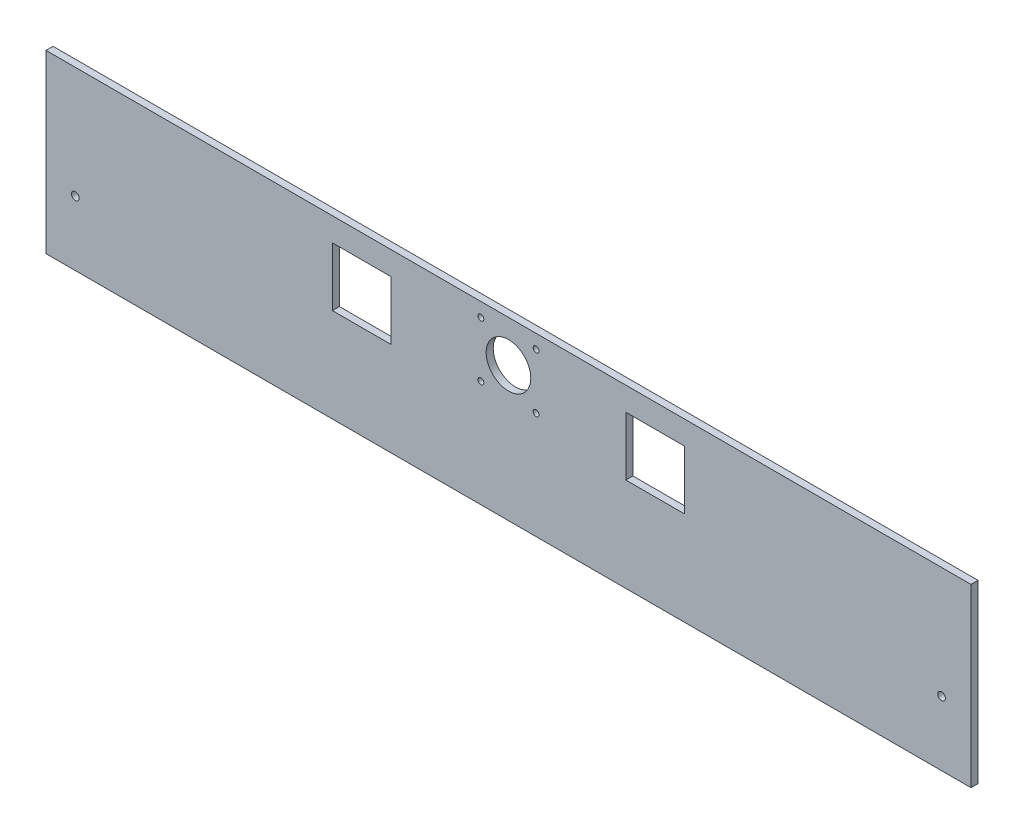
ISO-10303-21;
HEADER;
FILE_DESCRIPTION(('STEP AP214'),'2;1');
FILE_NAME('part.step','',(''),(''),'','','');
FILE_SCHEMA(('AUTOMOTIVE_DESIGN { 1 0 10303 214 1 1 1 1 }'));
ENDSEC;
DATA;
#1=APPLICATION_CONTEXT('core data for automotive mechanical design processes');
#2=APPLICATION_PROTOCOL_DEFINITION('international standard','automotive_design',2000,#1);
#3=PRODUCT_CONTEXT('',#1,'mechanical');
#4=PRODUCT('Part','Part','',(#3));
#5=PRODUCT_RELATED_PRODUCT_CATEGORY('part','',(#4));
#6=PRODUCT_DEFINITION_FORMATION('','',#4);
#7=PRODUCT_DEFINITION_CONTEXT('part definition',#1,'design');
#8=PRODUCT_DEFINITION('design','',#6,#7);
#9=PRODUCT_DEFINITION_SHAPE('','',#8);
#10=(LENGTH_UNIT() NAMED_UNIT(*) SI_UNIT(.MILLI.,.METRE.));
#11=(NAMED_UNIT(*) PLANE_ANGLE_UNIT() SI_UNIT($,.RADIAN.));
#12=(NAMED_UNIT(*) SI_UNIT($,.STERADIAN.) SOLID_ANGLE_UNIT());
#13=UNCERTAINTY_MEASURE_WITH_UNIT(LENGTH_MEASURE(1.E-05),#10,'distance_accuracy_value','');
#14=(GEOMETRIC_REPRESENTATION_CONTEXT(3) GLOBAL_UNCERTAINTY_ASSIGNED_CONTEXT((#13)) GLOBAL_UNIT_ASSIGNED_CONTEXT((#10,
#11,#12)) REPRESENTATION_CONTEXT('',''));
#15=CARTESIAN_POINT('',(0.,0.,0.));
#16=DIRECTION('',(0.,0.,1.));
#17=DIRECTION('',(1.,0.,0.));
#18=AXIS2_PLACEMENT_3D('',#15,#16,#17);
#19=CARTESIAN_POINT('',(394.,-75.,-6.));
#20=DIRECTION('',(1.,0.,0.));
#21=DIRECTION('',(0.,0.,-1.));
#22=AXIS2_PLACEMENT_3D('',#19,#20,#21);
#23=PLANE('',#22);
#24=DIRECTION('',(0.,1.,0.));
#25=VECTOR('',#24,1.);
#26=CARTESIAN_POINT('',(394.,-75.,0.));
#27=LINE('',#26,#25);
#28=CARTESIAN_POINT('',(394.,-75.,0.));
#29=VERTEX_POINT('',#28);
#30=CARTESIAN_POINT('',(394.,75.,0.));
#31=VERTEX_POINT('',#30);
#32=EDGE_CURVE('E166',#29,#31,#27,.T.);
#33=ORIENTED_EDGE('',*,*,#32,.F.);
#34=DIRECTION('',(0.,0.,1.));
#35=VECTOR('',#34,1.);
#36=CARTESIAN_POINT('',(394.,-75.,-6.));
#37=LINE('',#36,#35);
#38=CARTESIAN_POINT('',(394.,-75.,-6.));
#39=VERTEX_POINT('',#38);
#40=EDGE_CURVE('E11',#39,#29,#37,.T.);
#41=ORIENTED_EDGE('',*,*,#40,.F.);
#42=DIRECTION('',(0.,1.,0.));
#43=VECTOR('',#42,1.);
#44=CARTESIAN_POINT('',(394.,-75.,-6.));
#45=LINE('',#44,#43);
#46=CARTESIAN_POINT('',(394.,75.,-6.));
#47=VERTEX_POINT('',#46);
#48=EDGE_CURVE('E199',#39,#47,#45,.T.);
#49=ORIENTED_EDGE('',*,*,#48,.T.);
#50=DIRECTION('',(0.,0.,1.));
#51=VECTOR('',#50,1.);
#52=CARTESIAN_POINT('',(394.,75.,-6.));
#53=LINE('',#52,#51);
#54=EDGE_CURVE('E39',#47,#31,#53,.T.);
#55=ORIENTED_EDGE('',*,*,#54,.T.);
#56=EDGE_LOOP('',(#33,#41,#49,#55));
#57=FACE_BOUND('',#56,.T.);
#58=ADVANCED_FACE('F36',(#57),#23,.T.);
#59=CARTESIAN_POINT('',(-394.,-75.,-6.));
#60=DIRECTION('',(0.,-1.,0.));
#61=DIRECTION('',(0.,0.,-1.));
#62=AXIS2_PLACEMENT_3D('',#59,#60,#61);
#63=PLANE('',#62);
#64=DIRECTION('',(1.,0.,0.));
#65=VECTOR('',#64,1.);
#66=CARTESIAN_POINT('',(-394.,-75.,0.));
#67=LINE('',#66,#65);
#68=CARTESIAN_POINT('',(-394.,-75.,0.));
#69=VERTEX_POINT('',#68);
#70=EDGE_CURVE('E203',#69,#29,#67,.T.);
#71=ORIENTED_EDGE('',*,*,#70,.F.);
#72=DIRECTION('',(0.,0.,1.));
#73=VECTOR('',#72,1.);
#74=CARTESIAN_POINT('',(-394.,-75.,-6.));
#75=LINE('',#74,#73);
#76=CARTESIAN_POINT('',(-394.,-75.,-6.));
#77=VERTEX_POINT('',#76);
#78=EDGE_CURVE('E44',#77,#69,#75,.T.);
#79=ORIENTED_EDGE('',*,*,#78,.F.);
#80=DIRECTION('',(1.,0.,0.));
#81=VECTOR('',#80,1.);
#82=CARTESIAN_POINT('',(-394.,-75.,-6.));
#83=LINE('',#82,#81);
#84=EDGE_CURVE('E209',#77,#39,#83,.T.);
#85=ORIENTED_EDGE('',*,*,#84,.T.);
#86=ORIENTED_EDGE('',*,*,#40,.T.);
#87=EDGE_LOOP('',(#71,#79,#85,#86));
#88=FACE_BOUND('',#87,.T.);
#89=ADVANCED_FACE('F235',(#88),#63,.T.);
#90=CARTESIAN_POINT('',(-394.,-75.,-6.));
#91=DIRECTION('',(-1.,0.,0.));
#92=DIRECTION('',(0.,0.,1.));
#93=AXIS2_PLACEMENT_3D('',#90,#91,#92);
#94=PLANE('',#93);
#95=DIRECTION('',(0.,-1.,0.));
#96=VECTOR('',#95,1.);
#97=CARTESIAN_POINT('',(-394.,-75.,0.));
#98=LINE('',#97,#96);
#99=CARTESIAN_POINT('',(-394.,75.,0.));
#100=VERTEX_POINT('',#99);
#101=EDGE_CURVE('E217',#100,#69,#98,.T.);
#102=ORIENTED_EDGE('',*,*,#101,.F.);
#103=DIRECTION('',(0.,0.,1.));
#104=VECTOR('',#103,1.);
#105=CARTESIAN_POINT('',(-394.,75.,-6.));
#106=LINE('',#105,#104);
#107=CARTESIAN_POINT('',(-394.,75.,-6.));
#108=VERTEX_POINT('',#107);
#109=EDGE_CURVE('E222',#108,#100,#106,.T.);
#110=ORIENTED_EDGE('',*,*,#109,.F.);
#111=DIRECTION('',(0.,-1.,0.));
#112=VECTOR('',#111,1.);
#113=CARTESIAN_POINT('',(-394.,-75.,-6.));
#114=LINE('',#113,#112);
#115=EDGE_CURVE('E206',#108,#77,#114,.T.);
#116=ORIENTED_EDGE('',*,*,#115,.T.);
#117=ORIENTED_EDGE('',*,*,#78,.T.);
#118=EDGE_LOOP('',(#102,#110,#116,#117));
#119=FACE_BOUND('',#118,.T.);
#120=ADVANCED_FACE('F240',(#119),#94,.T.);
#121=CARTESIAN_POINT('',(-394.,75.,-6.));
#122=DIRECTION('',(0.,1.,0.));
#123=DIRECTION('',(0.,0.,1.));
#124=AXIS2_PLACEMENT_3D('',#121,#122,#123);
#125=PLANE('',#124);
#126=DIRECTION('',(-1.,0.,0.));
#127=VECTOR('',#126,1.);
#128=CARTESIAN_POINT('',(-394.,75.,0.));
#129=LINE('',#128,#127);
#130=EDGE_CURVE('E214',#31,#100,#129,.T.);
#131=ORIENTED_EDGE('',*,*,#130,.F.);
#132=ORIENTED_EDGE('',*,*,#54,.F.);
#133=DIRECTION('',(-1.,0.,0.));
#134=VECTOR('',#133,1.);
#135=CARTESIAN_POINT('',(-394.,75.,-6.));
#136=LINE('',#135,#134);
#137=EDGE_CURVE('E202',#47,#108,#136,.T.);
#138=ORIENTED_EDGE('',*,*,#137,.T.);
#139=ORIENTED_EDGE('',*,*,#109,.T.);
#140=EDGE_LOOP('',(#131,#132,#138,#139));
#141=FACE_BOUND('',#140,.T.);
#142=ADVANCED_FACE('F230',(#141),#125,.T.);
#143=CARTESIAN_POINT('',(0.,0.,-6.));
#144=DIRECTION('',(0.,0.,-1.));
#145=DIRECTION('',(-1.,0.,0.));
#146=AXIS2_PLACEMENT_3D('',#143,#144,#145);
#147=PLANE('',#146);
#148=CARTESIAN_POINT('',(369.,-19.9999999999999,-6.));
#149=DIRECTION('',(0.,0.,-1.));
#150=DIRECTION('',(-1.,0.,0.));
#151=AXIS2_PLACEMENT_3D('',#148,#149,#150);
#152=CIRCLE('',#151,3.24999999999995);
#153=CARTESIAN_POINT('',(365.75,-19.9999999999999,-6.));
#154=VERTEX_POINT('',#153);
#155=EDGE_CURVE('E439',#154,#154,#152,.T.);
#156=ORIENTED_EDGE('',*,*,#155,.F.);
#157=EDGE_LOOP('',(#156));
#158=FACE_BOUND('',#157,.T.);
#159=CARTESIAN_POINT('',(-369.,-20.,-6.));
#160=DIRECTION('',(0.,0.,-1.));
#161=DIRECTION('',(-1.,0.,0.));
#162=AXIS2_PLACEMENT_3D('',#159,#160,#161);
#163=CIRCLE('',#162,3.24999999999995);
#164=CARTESIAN_POINT('',(-372.25,-20.,-6.));
#165=VERTEX_POINT('',#164);
#166=EDGE_CURVE('E443',#165,#165,#163,.T.);
#167=ORIENTED_EDGE('',*,*,#166,.F.);
#168=EDGE_LOOP('',(#167));
#169=FACE_BOUND('',#168,.T.);
#170=CARTESIAN_POINT('',(-23.5,63.15,-6.));
#171=DIRECTION('',(0.,0.,-1.));
#172=DIRECTION('',(-1.,0.,0.));
#173=AXIS2_PLACEMENT_3D('',#170,#171,#172);
#174=CIRCLE('',#173,2.5);
#175=CARTESIAN_POINT('',(-26.,63.15,-6.));
#176=VERTEX_POINT('',#175);
#177=EDGE_CURVE('E153',#176,#176,#174,.T.);
#178=ORIENTED_EDGE('',*,*,#177,.F.);
#179=EDGE_LOOP('',(#178));
#180=FACE_BOUND('',#179,.T.);
#181=CARTESIAN_POINT('',(-23.5,16.15,-6.));
#182=DIRECTION('',(0.,0.,-1.));
#183=DIRECTION('',(-1.,0.,0.));
#184=AXIS2_PLACEMENT_3D('',#181,#182,#183);
#185=CIRCLE('',#184,2.5);
#186=CARTESIAN_POINT('',(-26.,16.15,-6.));
#187=VERTEX_POINT('',#186);
#188=EDGE_CURVE('E475',#187,#187,#185,.T.);
#189=ORIENTED_EDGE('',*,*,#188,.F.);
#190=EDGE_LOOP('',(#189));
#191=FACE_BOUND('',#190,.T.);
#192=CARTESIAN_POINT('',(23.5,16.15,-6.));
#193=DIRECTION('',(0.,0.,-1.));
#194=DIRECTION('',(-1.,0.,0.));
#195=AXIS2_PLACEMENT_3D('',#192,#193,#194);
#196=CIRCLE('',#195,2.5);
#197=CARTESIAN_POINT('',(21.,16.15,-6.));
#198=VERTEX_POINT('',#197);
#199=EDGE_CURVE('E473',#198,#198,#196,.T.);
#200=ORIENTED_EDGE('',*,*,#199,.F.);
#201=EDGE_LOOP('',(#200));
#202=FACE_BOUND('',#201,.T.);
#203=CARTESIAN_POINT('',(23.5,63.15,-6.));
#204=DIRECTION('',(0.,0.,-1.));
#205=DIRECTION('',(-1.,0.,0.));
#206=AXIS2_PLACEMENT_3D('',#203,#204,#205);
#207=CIRCLE('',#206,2.5);
#208=CARTESIAN_POINT('',(21.,63.15,-6.));
#209=VERTEX_POINT('',#208);
#210=EDGE_CURVE('E470',#209,#209,#207,.T.);
#211=ORIENTED_EDGE('',*,*,#210,.F.);
#212=EDGE_LOOP('',(#211));
#213=FACE_BOUND('',#212,.T.);
#214=CARTESIAN_POINT('',(0.,39.65,-6.));
#215=DIRECTION('',(0.,0.,-1.));
#216=DIRECTION('',(-1.,0.,0.));
#217=AXIS2_PLACEMENT_3D('',#214,#215,#216);
#218=CIRCLE('',#217,19.);
#219=CARTESIAN_POINT('',(-19.,39.65,-6.));
#220=VERTEX_POINT('',#219);
#221=EDGE_CURVE('E467',#220,#220,#218,.T.);
#222=ORIENTED_EDGE('',*,*,#221,.F.);
#223=EDGE_LOOP('',(#222));
#224=FACE_BOUND('',#223,.T.);
#225=DIRECTION('',(0.,1.,0.));
#226=VECTOR('',#225,1.);
#227=CARTESIAN_POINT('',(-100.,5.,-6.));
#228=LINE('',#227,#226);
#229=CARTESIAN_POINT('',(-100.,5.,-6.));
#230=VERTEX_POINT('',#229);
#231=CARTESIAN_POINT('',(-100.,55.,-6.));
#232=VERTEX_POINT('',#231);
#233=EDGE_CURVE('E129',#230,#232,#228,.T.);
#234=ORIENTED_EDGE('',*,*,#233,.T.);
#235=DIRECTION('',(-1.,0.,0.));
#236=VECTOR('',#235,1.);
#237=CARTESIAN_POINT('',(-150.,55.,-6.));
#238=LINE('',#237,#236);
#239=CARTESIAN_POINT('',(-150.,55.,-6.));
#240=VERTEX_POINT('',#239);
#241=EDGE_CURVE('E140',#232,#240,#238,.T.);
#242=ORIENTED_EDGE('',*,*,#241,.T.);
#243=DIRECTION('',(0.,-1.,0.));
#244=VECTOR('',#243,1.);
#245=CARTESIAN_POINT('',(-150.,5.,-6.));
#246=LINE('',#245,#244);
#247=CARTESIAN_POINT('',(-150.,5.,-6.));
#248=VERTEX_POINT('',#247);
#249=EDGE_CURVE('E52',#240,#248,#246,.T.);
#250=ORIENTED_EDGE('',*,*,#249,.T.);
#251=DIRECTION('',(1.,0.,0.));
#252=VECTOR('',#251,1.);
#253=CARTESIAN_POINT('',(-150.,5.,-6.));
#254=LINE('',#253,#252);
#255=EDGE_CURVE('E137',#248,#230,#254,.T.);
#256=ORIENTED_EDGE('',*,*,#255,.T.);
#257=EDGE_LOOP('',(#234,#242,#250,#256));
#258=FACE_BOUND('',#257,.T.);
#259=DIRECTION('',(0.,1.,0.));
#260=VECTOR('',#259,1.);
#261=CARTESIAN_POINT('',(150.,5.00000000000001,-6.));
#262=LINE('',#261,#260);
#263=CARTESIAN_POINT('',(150.,5.00000000000001,-6.));
#264=VERTEX_POINT('',#263);
#265=CARTESIAN_POINT('',(150.,55.,-6.));
#266=VERTEX_POINT('',#265);
#267=EDGE_CURVE('E170',#264,#266,#262,.T.);
#268=ORIENTED_EDGE('',*,*,#267,.T.);
#269=DIRECTION('',(-1.,0.,0.));
#270=VECTOR('',#269,1.);
#271=CARTESIAN_POINT('',(100.,55.,-6.));
#272=LINE('',#271,#270);
#273=CARTESIAN_POINT('',(100.,55.,-6.));
#274=VERTEX_POINT('',#273);
#275=EDGE_CURVE('E173',#266,#274,#272,.T.);
#276=ORIENTED_EDGE('',*,*,#275,.T.);
#277=DIRECTION('',(0.,-1.,0.));
#278=VECTOR('',#277,1.);
#279=CARTESIAN_POINT('',(100.,5.00000000000001,-6.));
#280=LINE('',#279,#278);
#281=CARTESIAN_POINT('',(100.,5.00000000000001,-6.));
#282=VERTEX_POINT('',#281);
#283=EDGE_CURVE('E60',#274,#282,#280,.T.);
#284=ORIENTED_EDGE('',*,*,#283,.T.);
#285=DIRECTION('',(1.,0.,0.));
#286=VECTOR('',#285,1.);
#287=CARTESIAN_POINT('',(100.,5.00000000000001,-6.));
#288=LINE('',#287,#286);
#289=EDGE_CURVE('E178',#282,#264,#288,.T.);
#290=ORIENTED_EDGE('',*,*,#289,.T.);
#291=EDGE_LOOP('',(#268,#276,#284,#290));
#292=FACE_BOUND('',#291,.T.);
#293=ORIENTED_EDGE('',*,*,#48,.F.);
#294=ORIENTED_EDGE('',*,*,#84,.F.);
#295=ORIENTED_EDGE('',*,*,#115,.F.);
#296=ORIENTED_EDGE('',*,*,#137,.F.);
#297=EDGE_LOOP('',(#293,#294,#295,#296));
#298=FACE_BOUND('',#297,.T.);
#299=ADVANCED_FACE('F144',(#158,#169,#180,#191,#202,#213,#224,#258,#292,#298),#147,.T.);
#300=CARTESIAN_POINT('',(0.,0.,0.));
#301=DIRECTION('',(0.,0.,-1.));
#302=DIRECTION('',(-1.,0.,0.));
#303=AXIS2_PLACEMENT_3D('',#300,#301,#302);
#304=PLANE('',#303);
#305=CARTESIAN_POINT('',(369.,-19.9999999999999,0.));
#306=DIRECTION('',(0.,0.,1.));
#307=DIRECTION('',(1.,0.,0.));
#308=AXIS2_PLACEMENT_3D('',#305,#306,#307);
#309=CIRCLE('',#308,3.24999999999995);
#310=CARTESIAN_POINT('',(372.25,-19.9999999999999,0.));
#311=VERTEX_POINT('',#310);
#312=EDGE_CURVE('E442',#311,#311,#309,.T.);
#313=ORIENTED_EDGE('',*,*,#312,.F.);
#314=EDGE_LOOP('',(#313));
#315=FACE_BOUND('',#314,.T.);
#316=CARTESIAN_POINT('',(-369.,-20.,0.));
#317=DIRECTION('',(0.,0.,1.));
#318=DIRECTION('',(1.,0.,0.));
#319=AXIS2_PLACEMENT_3D('',#316,#317,#318);
#320=CIRCLE('',#319,3.24999999999995);
#321=CARTESIAN_POINT('',(-365.75,-20.,0.));
#322=VERTEX_POINT('',#321);
#323=EDGE_CURVE('E444',#322,#322,#320,.T.);
#324=ORIENTED_EDGE('',*,*,#323,.F.);
#325=EDGE_LOOP('',(#324));
#326=FACE_BOUND('',#325,.T.);
#327=CARTESIAN_POINT('',(-23.5,63.15,0.));
#328=DIRECTION('',(0.,0.,1.));
#329=DIRECTION('',(1.,0.,0.));
#330=AXIS2_PLACEMENT_3D('',#327,#328,#329);
#331=CIRCLE('',#330,2.5);
#332=CARTESIAN_POINT('',(-21.,63.15,0.));
#333=VERTEX_POINT('',#332);
#334=EDGE_CURVE('E452',#333,#333,#331,.T.);
#335=ORIENTED_EDGE('',*,*,#334,.F.);
#336=EDGE_LOOP('',(#335));
#337=FACE_BOUND('',#336,.T.);
#338=CARTESIAN_POINT('',(-23.5,16.15,0.));
#339=DIRECTION('',(0.,0.,1.));
#340=DIRECTION('',(1.,0.,0.));
#341=AXIS2_PLACEMENT_3D('',#338,#339,#340);
#342=CIRCLE('',#341,2.5);
#343=CARTESIAN_POINT('',(-21.,16.15,0.));
#344=VERTEX_POINT('',#343);
#345=EDGE_CURVE('E460',#344,#344,#342,.T.);
#346=ORIENTED_EDGE('',*,*,#345,.F.);
#347=EDGE_LOOP('',(#346));
#348=FACE_BOUND('',#347,.T.);
#349=CARTESIAN_POINT('',(23.5,16.15,0.));
#350=DIRECTION('',(0.,0.,1.));
#351=DIRECTION('',(1.,0.,0.));
#352=AXIS2_PLACEMENT_3D('',#349,#350,#351);
#353=CIRCLE('',#352,2.5);
#354=CARTESIAN_POINT('',(26.,16.15,0.));
#355=VERTEX_POINT('',#354);
#356=EDGE_CURVE('E457',#355,#355,#353,.T.);
#357=ORIENTED_EDGE('',*,*,#356,.F.);
#358=EDGE_LOOP('',(#357));
#359=FACE_BOUND('',#358,.T.);
#360=CARTESIAN_POINT('',(23.5,63.15,0.));
#361=DIRECTION('',(0.,0.,1.));
#362=DIRECTION('',(1.,0.,0.));
#363=AXIS2_PLACEMENT_3D('',#360,#361,#362);
#364=CIRCLE('',#363,2.5);
#365=CARTESIAN_POINT('',(26.,63.15,0.));
#366=VERTEX_POINT('',#365);
#367=EDGE_CURVE('E453',#366,#366,#364,.T.);
#368=ORIENTED_EDGE('',*,*,#367,.F.);
#369=EDGE_LOOP('',(#368));
#370=FACE_BOUND('',#369,.T.);
#371=CARTESIAN_POINT('',(0.,39.65,0.));
#372=DIRECTION('',(0.,0.,1.));
#373=DIRECTION('',(1.,0.,0.));
#374=AXIS2_PLACEMENT_3D('',#371,#372,#373);
#375=CIRCLE('',#374,19.);
#376=CARTESIAN_POINT('',(19.,39.65,0.));
#377=VERTEX_POINT('',#376);
#378=EDGE_CURVE('E456',#377,#377,#375,.T.);
#379=ORIENTED_EDGE('',*,*,#378,.F.);
#380=EDGE_LOOP('',(#379));
#381=FACE_BOUND('',#380,.T.);
#382=DIRECTION('',(-1.,0.,0.));
#383=VECTOR('',#382,1.);
#384=CARTESIAN_POINT('',(-150.,55.,0.));
#385=LINE('',#384,#383);
#386=CARTESIAN_POINT('',(-100.,55.,0.));
#387=VERTEX_POINT('',#386);
#388=CARTESIAN_POINT('',(-150.,55.,0.));
#389=VERTEX_POINT('',#388);
#390=EDGE_CURVE('E159',#387,#389,#385,.T.);
#391=ORIENTED_EDGE('',*,*,#390,.F.);
#392=DIRECTION('',(0.,1.,0.));
#393=VECTOR('',#392,1.);
#394=CARTESIAN_POINT('',(-100.,5.,0.));
#395=LINE('',#394,#393);
#396=CARTESIAN_POINT('',(-100.,5.,0.));
#397=VERTEX_POINT('',#396);
#398=EDGE_CURVE('E132',#397,#387,#395,.T.);
#399=ORIENTED_EDGE('',*,*,#398,.F.);
#400=DIRECTION('',(1.,0.,0.));
#401=VECTOR('',#400,1.);
#402=CARTESIAN_POINT('',(-150.,5.,0.));
#403=LINE('',#402,#401);
#404=CARTESIAN_POINT('',(-150.,5.,0.));
#405=VERTEX_POINT('',#404);
#406=EDGE_CURVE('E147',#405,#397,#403,.T.);
#407=ORIENTED_EDGE('',*,*,#406,.F.);
#408=DIRECTION('',(0.,-1.,0.));
#409=VECTOR('',#408,1.);
#410=CARTESIAN_POINT('',(-150.,5.,0.));
#411=LINE('',#410,#409);
#412=EDGE_CURVE('E150',#389,#405,#411,.T.);
#413=ORIENTED_EDGE('',*,*,#412,.F.);
#414=EDGE_LOOP('',(#391,#399,#407,#413));
#415=FACE_BOUND('',#414,.T.);
#416=DIRECTION('',(-1.,0.,0.));
#417=VECTOR('',#416,1.);
#418=CARTESIAN_POINT('',(100.,55.,0.));
#419=LINE('',#418,#417);
#420=CARTESIAN_POINT('',(150.,55.,0.));
#421=VERTEX_POINT('',#420);
#422=CARTESIAN_POINT('',(100.,55.,0.));
#423=VERTEX_POINT('',#422);
#424=EDGE_CURVE('E184',#421,#423,#419,.T.);
#425=ORIENTED_EDGE('',*,*,#424,.F.);
#426=DIRECTION('',(0.,1.,0.));
#427=VECTOR('',#426,1.);
#428=CARTESIAN_POINT('',(150.,5.00000000000001,0.));
#429=LINE('',#428,#427);
#430=CARTESIAN_POINT('',(150.,5.00000000000001,0.));
#431=VERTEX_POINT('',#430);
#432=EDGE_CURVE('E182',#431,#421,#429,.T.);
#433=ORIENTED_EDGE('',*,*,#432,.F.);
#434=DIRECTION('',(1.,0.,0.));
#435=VECTOR('',#434,1.);
#436=CARTESIAN_POINT('',(100.,5.00000000000001,0.));
#437=LINE('',#436,#435);
#438=CARTESIAN_POINT('',(100.,5.00000000000001,0.));
#439=VERTEX_POINT('',#438);
#440=EDGE_CURVE('E174',#439,#431,#437,.T.);
#441=ORIENTED_EDGE('',*,*,#440,.F.);
#442=DIRECTION('',(0.,-1.,0.));
#443=VECTOR('',#442,1.);
#444=CARTESIAN_POINT('',(100.,5.00000000000001,0.));
#445=LINE('',#444,#443);
#446=EDGE_CURVE('E187',#423,#439,#445,.T.);
#447=ORIENTED_EDGE('',*,*,#446,.F.);
#448=EDGE_LOOP('',(#425,#433,#441,#447));
#449=FACE_BOUND('',#448,.T.);
#450=ORIENTED_EDGE('',*,*,#32,.T.);
#451=ORIENTED_EDGE('',*,*,#130,.T.);
#452=ORIENTED_EDGE('',*,*,#101,.T.);
#453=ORIENTED_EDGE('',*,*,#70,.T.);
#454=EDGE_LOOP('',(#450,#451,#452,#453));
#455=FACE_BOUND('',#454,.T.);
#456=ADVANCED_FACE('F232',(#315,#326,#337,#348,#359,#370,#381,#415,#449,#455),#304,.F.);
#457=CARTESIAN_POINT('',(150.,5.00000000000001,-6.));
#458=DIRECTION('',(1.,0.,0.));
#459=DIRECTION('',(0.,0.,-1.));
#460=AXIS2_PLACEMENT_3D('',#457,#458,#459);
#461=PLANE('',#460);
#462=ORIENTED_EDGE('',*,*,#432,.T.);
#463=DIRECTION('',(0.,0.,1.));
#464=VECTOR('',#463,1.);
#465=CARTESIAN_POINT('',(150.,55.,-6.));
#466=LINE('',#465,#464);
#467=EDGE_CURVE('E181',#266,#421,#466,.T.);
#468=ORIENTED_EDGE('',*,*,#467,.F.);
#469=ORIENTED_EDGE('',*,*,#267,.F.);
#470=DIRECTION('',(0.,0.,1.));
#471=VECTOR('',#470,1.);
#472=CARTESIAN_POINT('',(150.,5.00000000000001,-6.));
#473=LINE('',#472,#471);
#474=EDGE_CURVE('E160',#264,#431,#473,.T.);
#475=ORIENTED_EDGE('',*,*,#474,.T.);
#476=EDGE_LOOP('',(#462,#468,#469,#475));
#477=FACE_BOUND('',#476,.T.);
#478=ADVANCED_FACE('F275',(#477),#461,.F.);
#479=CARTESIAN_POINT('',(100.,5.00000000000001,-6.));
#480=DIRECTION('',(0.,-1.,0.));
#481=DIRECTION('',(0.,0.,-1.));
#482=AXIS2_PLACEMENT_3D('',#479,#480,#481);
#483=PLANE('',#482);
#484=ORIENTED_EDGE('',*,*,#440,.T.);
#485=ORIENTED_EDGE('',*,*,#474,.F.);
#486=ORIENTED_EDGE('',*,*,#289,.F.);
#487=DIRECTION('',(0.,0.,1.));
#488=VECTOR('',#487,1.);
#489=CARTESIAN_POINT('',(100.,5.00000000000001,-6.));
#490=LINE('',#489,#488);
#491=EDGE_CURVE('E193',#282,#439,#490,.T.);
#492=ORIENTED_EDGE('',*,*,#491,.T.);
#493=EDGE_LOOP('',(#484,#485,#486,#492));
#494=FACE_BOUND('',#493,.T.);
#495=ADVANCED_FACE('F280',(#494),#483,.F.);
#496=CARTESIAN_POINT('',(100.,5.00000000000001,-6.));
#497=DIRECTION('',(-1.,0.,0.));
#498=DIRECTION('',(0.,0.,1.));
#499=AXIS2_PLACEMENT_3D('',#496,#497,#498);
#500=PLANE('',#499);
#501=ORIENTED_EDGE('',*,*,#446,.T.);
#502=ORIENTED_EDGE('',*,*,#491,.F.);
#503=ORIENTED_EDGE('',*,*,#283,.F.);
#504=DIRECTION('',(0.,0.,1.));
#505=VECTOR('',#504,1.);
#506=CARTESIAN_POINT('',(100.,55.,-6.));
#507=LINE('',#506,#505);
#508=EDGE_CURVE('E195',#274,#423,#507,.T.);
#509=ORIENTED_EDGE('',*,*,#508,.T.);
#510=EDGE_LOOP('',(#501,#502,#503,#509));
#511=FACE_BOUND('',#510,.T.);
#512=ADVANCED_FACE('F292',(#511),#500,.F.);
#513=CARTESIAN_POINT('',(100.,55.,-6.));
#514=DIRECTION('',(0.,1.,0.));
#515=DIRECTION('',(0.,0.,1.));
#516=AXIS2_PLACEMENT_3D('',#513,#514,#515);
#517=PLANE('',#516);
#518=ORIENTED_EDGE('',*,*,#424,.T.);
#519=ORIENTED_EDGE('',*,*,#508,.F.);
#520=ORIENTED_EDGE('',*,*,#275,.F.);
#521=ORIENTED_EDGE('',*,*,#467,.T.);
#522=EDGE_LOOP('',(#518,#519,#520,#521));
#523=FACE_BOUND('',#522,.T.);
#524=ADVANCED_FACE('F302',(#523),#517,.F.);
#525=CARTESIAN_POINT('',(-100.,5.,-6.));
#526=DIRECTION('',(1.,0.,0.));
#527=DIRECTION('',(0.,0.,-1.));
#528=AXIS2_PLACEMENT_3D('',#525,#526,#527);
#529=PLANE('',#528);
#530=ORIENTED_EDGE('',*,*,#398,.T.);
#531=DIRECTION('',(0.,0.,1.));
#532=VECTOR('',#531,1.);
#533=CARTESIAN_POINT('',(-100.,55.,-6.));
#534=LINE('',#533,#532);
#535=EDGE_CURVE('E125',#232,#387,#534,.T.);
#536=ORIENTED_EDGE('',*,*,#535,.F.);
#537=ORIENTED_EDGE('',*,*,#233,.F.);
#538=DIRECTION('',(0.,0.,1.));
#539=VECTOR('',#538,1.);
#540=CARTESIAN_POINT('',(-100.,5.,-6.));
#541=LINE('',#540,#539);
#542=EDGE_CURVE('E164',#230,#397,#541,.T.);
#543=ORIENTED_EDGE('',*,*,#542,.T.);
#544=EDGE_LOOP('',(#530,#536,#537,#543));
#545=FACE_BOUND('',#544,.T.);
#546=ADVANCED_FACE('F127',(#545),#529,.F.);
#547=CARTESIAN_POINT('',(-150.,5.,-6.));
#548=DIRECTION('',(0.,-1.,0.));
#549=DIRECTION('',(0.,0.,-1.));
#550=AXIS2_PLACEMENT_3D('',#547,#548,#549);
#551=PLANE('',#550);
#552=ORIENTED_EDGE('',*,*,#406,.T.);
#553=ORIENTED_EDGE('',*,*,#542,.F.);
#554=ORIENTED_EDGE('',*,*,#255,.F.);
#555=DIRECTION('',(0.,0.,1.));
#556=VECTOR('',#555,1.);
#557=CARTESIAN_POINT('',(-150.,5.,-6.));
#558=LINE('',#557,#556);
#559=EDGE_CURVE('E167',#248,#405,#558,.T.);
#560=ORIENTED_EDGE('',*,*,#559,.T.);
#561=EDGE_LOOP('',(#552,#553,#554,#560));
#562=FACE_BOUND('',#561,.T.);
#563=ADVANCED_FACE('F320',(#562),#551,.F.);
#564=CARTESIAN_POINT('',(-150.,5.,-6.));
#565=DIRECTION('',(-1.,0.,0.));
#566=DIRECTION('',(0.,0.,1.));
#567=AXIS2_PLACEMENT_3D('',#564,#565,#566);
#568=PLANE('',#567);
#569=ORIENTED_EDGE('',*,*,#412,.T.);
#570=ORIENTED_EDGE('',*,*,#559,.F.);
#571=ORIENTED_EDGE('',*,*,#249,.F.);
#572=DIRECTION('',(0.,0.,1.));
#573=VECTOR('',#572,1.);
#574=CARTESIAN_POINT('',(-150.,55.,-6.));
#575=LINE('',#574,#573);
#576=EDGE_CURVE('E136',#240,#389,#575,.T.);
#577=ORIENTED_EDGE('',*,*,#576,.T.);
#578=EDGE_LOOP('',(#569,#570,#571,#577));
#579=FACE_BOUND('',#578,.T.);
#580=ADVANCED_FACE('F329',(#579),#568,.F.);
#581=CARTESIAN_POINT('',(-150.,55.,-6.));
#582=DIRECTION('',(0.,1.,0.));
#583=DIRECTION('',(0.,0.,1.));
#584=AXIS2_PLACEMENT_3D('',#581,#582,#583);
#585=PLANE('',#584);
#586=ORIENTED_EDGE('',*,*,#390,.T.);
#587=ORIENTED_EDGE('',*,*,#576,.F.);
#588=ORIENTED_EDGE('',*,*,#241,.F.);
#589=ORIENTED_EDGE('',*,*,#535,.T.);
#590=EDGE_LOOP('',(#586,#587,#588,#589));
#591=FACE_BOUND('',#590,.T.);
#592=ADVANCED_FACE('F141',(#591),#585,.F.);
#593=CARTESIAN_POINT('',(0.,39.65,-10.));
#594=DIRECTION('',(0.,0.,1.));
#595=DIRECTION('',(1.,0.,0.));
#596=AXIS2_PLACEMENT_3D('',#593,#594,#595);
#597=CYLINDRICAL_SURFACE('',#596,19.);
#598=ORIENTED_EDGE('',*,*,#221,.T.);
#599=EDGE_LOOP('',(#598));
#600=FACE_BOUND('',#599,.T.);
#601=ORIENTED_EDGE('',*,*,#378,.T.);
#602=EDGE_LOOP('',(#601));
#603=FACE_BOUND('',#602,.T.);
#604=ADVANCED_FACE('F347',(#600,#603),#597,.F.);
#605=CARTESIAN_POINT('',(23.5,63.15,-10.));
#606=DIRECTION('',(0.,0.,1.));
#607=DIRECTION('',(1.,0.,0.));
#608=AXIS2_PLACEMENT_3D('',#605,#606,#607);
#609=CYLINDRICAL_SURFACE('',#608,2.5);
#610=ORIENTED_EDGE('',*,*,#210,.T.);
#611=EDGE_LOOP('',(#610));
#612=FACE_BOUND('',#611,.T.);
#613=ORIENTED_EDGE('',*,*,#367,.T.);
#614=EDGE_LOOP('',(#613));
#615=FACE_BOUND('',#614,.T.);
#616=ADVANCED_FACE('F356',(#612,#615),#609,.F.);
#617=CARTESIAN_POINT('',(23.5,16.15,-10.));
#618=DIRECTION('',(0.,0.,1.));
#619=DIRECTION('',(1.,0.,0.));
#620=AXIS2_PLACEMENT_3D('',#617,#618,#619);
#621=CYLINDRICAL_SURFACE('',#620,2.5);
#622=ORIENTED_EDGE('',*,*,#199,.T.);
#623=EDGE_LOOP('',(#622));
#624=FACE_BOUND('',#623,.T.);
#625=ORIENTED_EDGE('',*,*,#356,.T.);
#626=EDGE_LOOP('',(#625));
#627=FACE_BOUND('',#626,.T.);
#628=ADVANCED_FACE('F366',(#624,#627),#621,.F.);
#629=CARTESIAN_POINT('',(-23.5,16.15,-10.));
#630=DIRECTION('',(0.,0.,1.));
#631=DIRECTION('',(1.,0.,0.));
#632=AXIS2_PLACEMENT_3D('',#629,#630,#631);
#633=CYLINDRICAL_SURFACE('',#632,2.5);
#634=ORIENTED_EDGE('',*,*,#188,.T.);
#635=EDGE_LOOP('',(#634));
#636=FACE_BOUND('',#635,.T.);
#637=ORIENTED_EDGE('',*,*,#345,.T.);
#638=EDGE_LOOP('',(#637));
#639=FACE_BOUND('',#638,.T.);
#640=ADVANCED_FACE('F376',(#636,#639),#633,.F.);
#641=CARTESIAN_POINT('',(-23.5,63.15,-10.));
#642=DIRECTION('',(0.,0.,1.));
#643=DIRECTION('',(1.,0.,0.));
#644=AXIS2_PLACEMENT_3D('',#641,#642,#643);
#645=CYLINDRICAL_SURFACE('',#644,2.5);
#646=ORIENTED_EDGE('',*,*,#177,.T.);
#647=EDGE_LOOP('',(#646));
#648=FACE_BOUND('',#647,.T.);
#649=ORIENTED_EDGE('',*,*,#334,.T.);
#650=EDGE_LOOP('',(#649));
#651=FACE_BOUND('',#650,.T.);
#652=ADVANCED_FACE('F386',(#648,#651),#645,.F.);
#653=CARTESIAN_POINT('',(-369.,-20.,-10.));
#654=DIRECTION('',(0.,0.,1.));
#655=DIRECTION('',(1.,0.,0.));
#656=AXIS2_PLACEMENT_3D('',#653,#654,#655);
#657=CYLINDRICAL_SURFACE('',#656,3.24999999999995);
#658=ORIENTED_EDGE('',*,*,#166,.T.);
#659=EDGE_LOOP('',(#658));
#660=FACE_BOUND('',#659,.T.);
#661=ORIENTED_EDGE('',*,*,#323,.T.);
#662=EDGE_LOOP('',(#661));
#663=FACE_BOUND('',#662,.T.);
#664=ADVANCED_FACE('F396',(#660,#663),#657,.F.);
#665=CARTESIAN_POINT('',(369.,-19.9999999999999,-10.));
#666=DIRECTION('',(0.,0.,1.));
#667=DIRECTION('',(1.,0.,0.));
#668=AXIS2_PLACEMENT_3D('',#665,#666,#667);
#669=CYLINDRICAL_SURFACE('',#668,3.24999999999995);
#670=ORIENTED_EDGE('',*,*,#155,.T.);
#671=EDGE_LOOP('',(#670));
#672=FACE_BOUND('',#671,.T.);
#673=ORIENTED_EDGE('',*,*,#312,.T.);
#674=EDGE_LOOP('',(#673));
#675=FACE_BOUND('',#674,.T.);
#676=ADVANCED_FACE('F422',(#672,#675),#669,.F.);
#677=CLOSED_SHELL('',(#58,#89,#120,#142,#299,#456,#478,#495,#512,#524,#546,#563,#580,#592,#604,
#616,#628,#640,#652,#664,#676));
#678=MANIFOLD_SOLID_BREP('B2',#677);
#679=ADVANCED_BREP_SHAPE_REPRESENTATION('',(#18,#678),#14);
#680=SHAPE_DEFINITION_REPRESENTATION(#9,#679);
ENDSEC;
END-ISO-10303-21;
